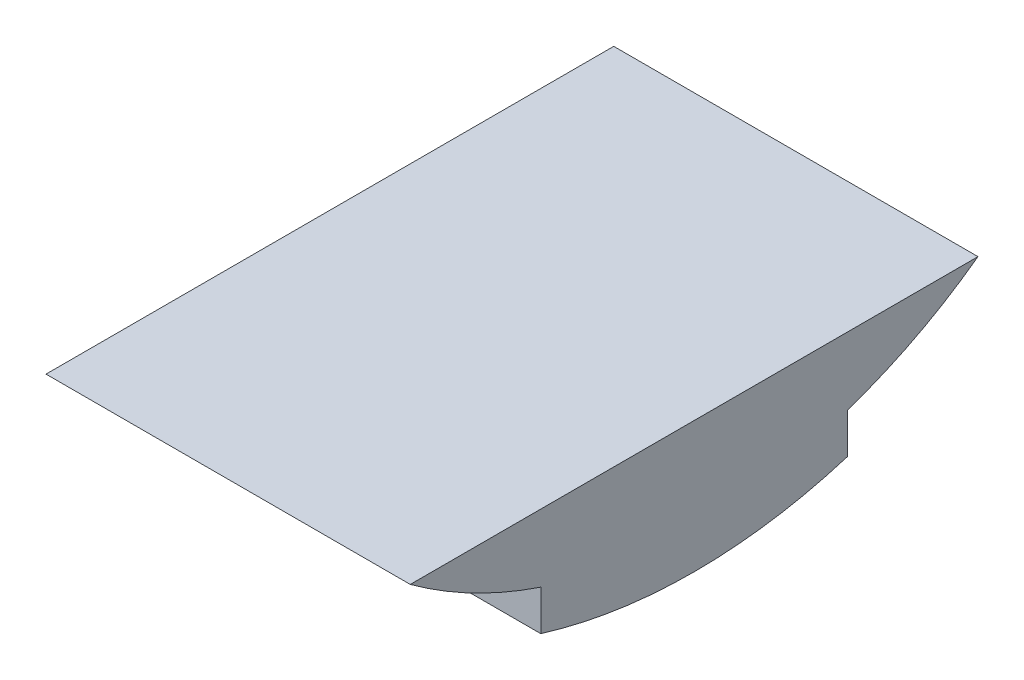
ISO-10303-21;
HEADER;
FILE_DESCRIPTION(('STEP AP214'),'2;1');
FILE_NAME('part.step','',(''),(''),'','','');
FILE_SCHEMA(('AUTOMOTIVE_DESIGN { 1 0 10303 214 1 1 1 1 }'));
ENDSEC;
DATA;
#1=APPLICATION_CONTEXT('core data for automotive mechanical design processes');
#2=APPLICATION_PROTOCOL_DEFINITION('international standard','automotive_design',2000,#1);
#3=PRODUCT_CONTEXT('',#1,'mechanical');
#4=PRODUCT('Part','Part','',(#3));
#5=PRODUCT_RELATED_PRODUCT_CATEGORY('part','',(#4));
#6=PRODUCT_DEFINITION_FORMATION('','',#4);
#7=PRODUCT_DEFINITION_CONTEXT('part definition',#1,'design');
#8=PRODUCT_DEFINITION('design','',#6,#7);
#9=PRODUCT_DEFINITION_SHAPE('','',#8);
#10=(LENGTH_UNIT() NAMED_UNIT(*) SI_UNIT(.MILLI.,.METRE.));
#11=(NAMED_UNIT(*) PLANE_ANGLE_UNIT() SI_UNIT($,.RADIAN.));
#12=(NAMED_UNIT(*) SI_UNIT($,.STERADIAN.) SOLID_ANGLE_UNIT());
#13=UNCERTAINTY_MEASURE_WITH_UNIT(LENGTH_MEASURE(1.E-05),#10,'distance_accuracy_value','');
#14=(GEOMETRIC_REPRESENTATION_CONTEXT(3) GLOBAL_UNCERTAINTY_ASSIGNED_CONTEXT((#13)) GLOBAL_UNIT_ASSIGNED_CONTEXT((#10,
#11,#12)) REPRESENTATION_CONTEXT('',''));
#15=CARTESIAN_POINT('',(0.,0.,0.));
#16=DIRECTION('',(0.,0.,1.));
#17=DIRECTION('',(1.,0.,0.));
#18=AXIS2_PLACEMENT_3D('',#15,#16,#17);
#19=CARTESIAN_POINT('',(-100.,100.,340.));
#20=DIRECTION('',(0.,-1.,0.));
#21=DIRECTION('',(0.,0.,-1.));
#22=AXIS2_PLACEMENT_3D('',#19,#20,#21);
#23=PLANE('',#22);
#24=DIRECTION('',(0.,0.,1.));
#25=VECTOR('',#24,1.);
#26=CARTESIAN_POINT('',(91.7033765112788,100.,340.));
#27=LINE('',#26,#25);
#28=CARTESIAN_POINT('',(91.7033765112788,100.,19.7372667879432));
#29=VERTEX_POINT('',#28);
#30=CARTESIAN_POINT('',(91.7033765112788,100.,315.883621072045));
#31=VERTEX_POINT('',#30);
#32=EDGE_CURVE('E11',#29,#31,#27,.T.);
#33=ORIENTED_EDGE('',*,*,#32,.F.);
#34=DIRECTION('',(1.,0.,0.));
#35=VECTOR('',#34,1.);
#36=CARTESIAN_POINT('',(-308.296623488721,100.,19.7372667879432));
#37=LINE('',#36,#35);
#38=CARTESIAN_POINT('',(-98.2966234887212,100.,19.7372667879432));
#39=VERTEX_POINT('',#38);
#40=EDGE_CURVE('E52',#39,#29,#37,.T.);
#41=ORIENTED_EDGE('',*,*,#40,.F.);
#42=DIRECTION('',(0.,0.,1.));
#43=VECTOR('',#42,1.);
#44=CARTESIAN_POINT('',(-98.2966234887212,100.,340.));
#45=LINE('',#44,#43);
#46=CARTESIAN_POINT('',(-98.2966234887212,100.,315.883621072045));
#47=VERTEX_POINT('',#46);
#48=EDGE_CURVE('E113',#39,#47,#45,.T.);
#49=ORIENTED_EDGE('',*,*,#48,.T.);
#50=DIRECTION('',(1.,0.,0.));
#51=VECTOR('',#50,1.);
#52=CARTESIAN_POINT('',(-308.296623488721,100.,315.883621072045));
#53=LINE('',#52,#51);
#54=EDGE_CURVE('E139',#31,#47,#53,.F.);
#55=ORIENTED_EDGE('',*,*,#54,.F.);
#56=EDGE_LOOP('',(#33,#41,#49,#55));
#57=FACE_BOUND('',#56,.T.);
#58=ADVANCED_FACE('F45',(#57),#23,.F.);
#59=CARTESIAN_POINT('',(-308.296623488721,302.464059334416,167.810443929994));
#60=DIRECTION('',(1.,0.,0.));
#61=DIRECTION('',(0.,0.,-1.));
#62=AXIS2_PLACEMENT_3D('',#59,#60,#61);
#63=CYLINDRICAL_SURFACE('',#62,250.833333333333);
#64=ORIENTED_EDGE('',*,*,#40,.T.);
#65=CARTESIAN_POINT('',(91.7033765112788,302.464059334416,167.810443929994));
#66=DIRECTION('',(1.,0.,0.));
#67=DIRECTION('',(0.,0.,-1.));
#68=AXIS2_PLACEMENT_3D('',#65,#66,#67);
#69=CIRCLE('',#68,250.833333333333);
#70=CARTESIAN_POINT('',(91.7033765112789,64.7302562875815,87.810443929994));
#71=VERTEX_POINT('',#70);
#72=EDGE_CURVE('E134',#71,#29,#69,.T.);
#73=ORIENTED_EDGE('',*,*,#72,.F.);
#74=DIRECTION('',(1.,0.,0.));
#75=VECTOR('',#74,1.);
#76=CARTESIAN_POINT('',(-308.296623488721,64.7302562875815,87.810443929994));
#77=LINE('',#76,#75);
#78=CARTESIAN_POINT('',(-98.2966234887212,64.7302562875815,87.810443929994));
#79=VERTEX_POINT('',#78);
#80=EDGE_CURVE('E129',#71,#79,#77,.F.);
#81=ORIENTED_EDGE('',*,*,#80,.T.);
#82=CARTESIAN_POINT('',(-98.2966234887212,302.464059334416,167.810443929994));
#83=DIRECTION('',(1.,0.,0.));
#84=DIRECTION('',(0.,0.,-1.));
#85=AXIS2_PLACEMENT_3D('',#82,#83,#84);
#86=CIRCLE('',#85,250.833333333333);
#87=EDGE_CURVE('E132',#39,#79,#86,.F.);
#88=ORIENTED_EDGE('',*,*,#87,.F.);
#89=EDGE_LOOP('',(#64,#73,#81,#88));
#90=FACE_BOUND('',#89,.T.);
#91=ADVANCED_FACE('F144',(#90),#63,.T.);
#92=ORIENTED_EDGE('',*,*,#54,.T.);
#93=CARTESIAN_POINT('',(-98.2966234887212,64.7302562875815,247.810443929994));
#94=VERTEX_POINT('',#93);
#95=EDGE_CURVE('E59',#94,#47,#86,.F.);
#96=ORIENTED_EDGE('',*,*,#95,.F.);
#97=DIRECTION('',(1.,0.,0.));
#98=VECTOR('',#97,1.);
#99=CARTESIAN_POINT('',(-308.296623488721,64.7302562875815,247.810443929994));
#100=LINE('',#99,#98);
#101=CARTESIAN_POINT('',(91.7033765112789,64.7302562875815,247.810443929994));
#102=VERTEX_POINT('',#101);
#103=EDGE_CURVE('E106',#94,#102,#100,.T.);
#104=ORIENTED_EDGE('',*,*,#103,.T.);
#105=EDGE_CURVE('E117',#31,#102,#69,.T.);
#106=ORIENTED_EDGE('',*,*,#105,.F.);
#107=EDGE_LOOP('',(#92,#96,#104,#106));
#108=FACE_BOUND('',#107,.T.);
#109=ADVANCED_FACE('F149',(#108),#63,.T.);
#110=CARTESIAN_POINT('',(91.7033765112788,302.464059334416,167.810443929994));
#111=DIRECTION('',(1.,0.,0.));
#112=DIRECTION('',(0.,0.,-1.));
#113=AXIS2_PLACEMENT_3D('',#110,#111,#112);
#114=PLANE('',#113);
#115=ORIENTED_EDGE('',*,*,#32,.T.);
#116=ORIENTED_EDGE('',*,*,#105,.T.);
#117=DIRECTION('',(0.,-1.,0.));
#118=VECTOR('',#117,1.);
#119=CARTESIAN_POINT('',(91.7033765112789,33.7578933503629,247.810443929994));
#120=LINE('',#119,#118);
#121=CARTESIAN_POINT('',(91.7033765112789,43.7157367418929,247.810443929994));
#122=VERTEX_POINT('',#121);
#123=EDGE_CURVE('E102',#102,#122,#120,.T.);
#124=ORIENTED_EDGE('',*,*,#123,.T.);
#125=CARTESIAN_POINT('',(91.7033765112789,302.464059334416,167.810443929994));
#126=DIRECTION('',(1.,0.,0.));
#127=DIRECTION('',(0.,0.,-1.));
#128=AXIS2_PLACEMENT_3D('',#125,#126,#127);
#129=CIRCLE('',#128,270.833333333333);
#130=CARTESIAN_POINT('',(91.7033765112788,43.7157367418928,87.810443929994));
#131=VERTEX_POINT('',#130);
#132=EDGE_CURVE('E109',#122,#131,#129,.T.);
#133=ORIENTED_EDGE('',*,*,#132,.T.);
#134=DIRECTION('',(0.,1.,0.));
#135=VECTOR('',#134,1.);
#136=CARTESIAN_POINT('',(91.7033765112789,33.7578933503629,87.810443929994));
#137=LINE('',#136,#135);
#138=EDGE_CURVE('E119',#131,#71,#137,.T.);
#139=ORIENTED_EDGE('',*,*,#138,.T.);
#140=ORIENTED_EDGE('',*,*,#72,.T.);
#141=EDGE_LOOP('',(#115,#116,#124,#133,#139,#140));
#142=FACE_BOUND('',#141,.T.);
#143=ADVANCED_FACE('F116',(#142),#114,.T.);
#144=CARTESIAN_POINT('',(-98.2966234887212,302.464059334416,167.810443929994));
#145=DIRECTION('',(1.,0.,0.));
#146=DIRECTION('',(0.,0.,-1.));
#147=AXIS2_PLACEMENT_3D('',#144,#145,#146);
#148=PLANE('',#147);
#149=ORIENTED_EDGE('',*,*,#87,.T.);
#150=DIRECTION('',(0.,1.,0.));
#151=VECTOR('',#150,1.);
#152=CARTESIAN_POINT('',(-98.2966234887212,33.7578933503629,87.810443929994));
#153=LINE('',#152,#151);
#154=CARTESIAN_POINT('',(-98.2966234887212,43.7157367418929,87.810443929994));
#155=VERTEX_POINT('',#154);
#156=EDGE_CURVE('E123',#155,#79,#153,.T.);
#157=ORIENTED_EDGE('',*,*,#156,.F.);
#158=CARTESIAN_POINT('',(-98.2966234887212,302.464059334416,167.810443929994));
#159=DIRECTION('',(1.,0.,0.));
#160=DIRECTION('',(0.,0.,-1.));
#161=AXIS2_PLACEMENT_3D('',#158,#159,#160);
#162=CIRCLE('',#161,270.833333333333);
#163=CARTESIAN_POINT('',(-98.2966234887212,43.7157367418929,247.810443929994));
#164=VERTEX_POINT('',#163);
#165=EDGE_CURVE('E114',#164,#155,#162,.T.);
#166=ORIENTED_EDGE('',*,*,#165,.F.);
#167=DIRECTION('',(0.,-1.,0.));
#168=VECTOR('',#167,1.);
#169=CARTESIAN_POINT('',(-98.2966234887212,33.7578933503629,247.810443929994));
#170=LINE('',#169,#168);
#171=EDGE_CURVE('E103',#94,#164,#170,.T.);
#172=ORIENTED_EDGE('',*,*,#171,.F.);
#173=ORIENTED_EDGE('',*,*,#95,.T.);
#174=ORIENTED_EDGE('',*,*,#48,.F.);
#175=EDGE_LOOP('',(#149,#157,#166,#172,#173,#174));
#176=FACE_BOUND('',#175,.T.);
#177=ADVANCED_FACE('F155',(#176),#148,.F.);
#178=CARTESIAN_POINT('',(91.7033765112789,33.7578933503629,87.810443929994));
#179=DIRECTION('',(0.,0.,1.));
#180=DIRECTION('',(0.,-1.,0.));
#181=AXIS2_PLACEMENT_3D('',#178,#179,#180);
#182=PLANE('',#181);
#183=ORIENTED_EDGE('',*,*,#80,.F.);
#184=ORIENTED_EDGE('',*,*,#138,.F.);
#185=DIRECTION('',(-1.,0.,0.));
#186=VECTOR('',#185,1.);
#187=CARTESIAN_POINT('',(111.703376511279,43.7157367418928,87.810443929994));
#188=LINE('',#187,#186);
#189=EDGE_CURVE('E111',#155,#131,#188,.F.);
#190=ORIENTED_EDGE('',*,*,#189,.F.);
#191=ORIENTED_EDGE('',*,*,#156,.T.);
#192=EDGE_LOOP('',(#183,#184,#190,#191));
#193=FACE_BOUND('',#192,.T.);
#194=ADVANCED_FACE('F189',(#193),#182,.F.);
#195=CARTESIAN_POINT('',(91.7033765112789,33.7578933503629,247.810443929994));
#196=DIRECTION('',(0.,0.,-1.));
#197=DIRECTION('',(0.,1.,0.));
#198=AXIS2_PLACEMENT_3D('',#195,#196,#197);
#199=PLANE('',#198);
#200=ORIENTED_EDGE('',*,*,#103,.F.);
#201=ORIENTED_EDGE('',*,*,#171,.T.);
#202=DIRECTION('',(-1.,0.,0.));
#203=VECTOR('',#202,1.);
#204=CARTESIAN_POINT('',(111.703376511279,43.7157367418929,247.810443929994));
#205=LINE('',#204,#203);
#206=EDGE_CURVE('E97',#122,#164,#205,.T.);
#207=ORIENTED_EDGE('',*,*,#206,.F.);
#208=ORIENTED_EDGE('',*,*,#123,.F.);
#209=EDGE_LOOP('',(#200,#201,#207,#208));
#210=FACE_BOUND('',#209,.T.);
#211=ADVANCED_FACE('F100',(#210),#199,.F.);
#212=CARTESIAN_POINT('',(457.987490632674,302.464059334416,167.810443929994));
#213=DIRECTION('',(-1.,0.,0.));
#214=DIRECTION('',(0.,0.,1.));
#215=AXIS2_PLACEMENT_3D('',#212,#213,#214);
#216=CYLINDRICAL_SURFACE('',#215,270.833333333333);
#217=ORIENTED_EDGE('',*,*,#189,.T.);
#218=ORIENTED_EDGE('',*,*,#132,.F.);
#219=ORIENTED_EDGE('',*,*,#206,.T.);
#220=ORIENTED_EDGE('',*,*,#165,.T.);
#221=EDGE_LOOP('',(#217,#218,#219,#220));
#222=FACE_BOUND('',#221,.T.);
#223=ADVANCED_FACE('F110',(#222),#216,.T.);
#224=CLOSED_SHELL('',(#58,#91,#109,#143,#177,#194,#211,#223));
#225=MANIFOLD_SOLID_BREP('B2',#224);
#226=ADVANCED_BREP_SHAPE_REPRESENTATION('',(#18,#225),#14);
#227=SHAPE_DEFINITION_REPRESENTATION(#9,#226);
ENDSEC;
END-ISO-10303-21;
